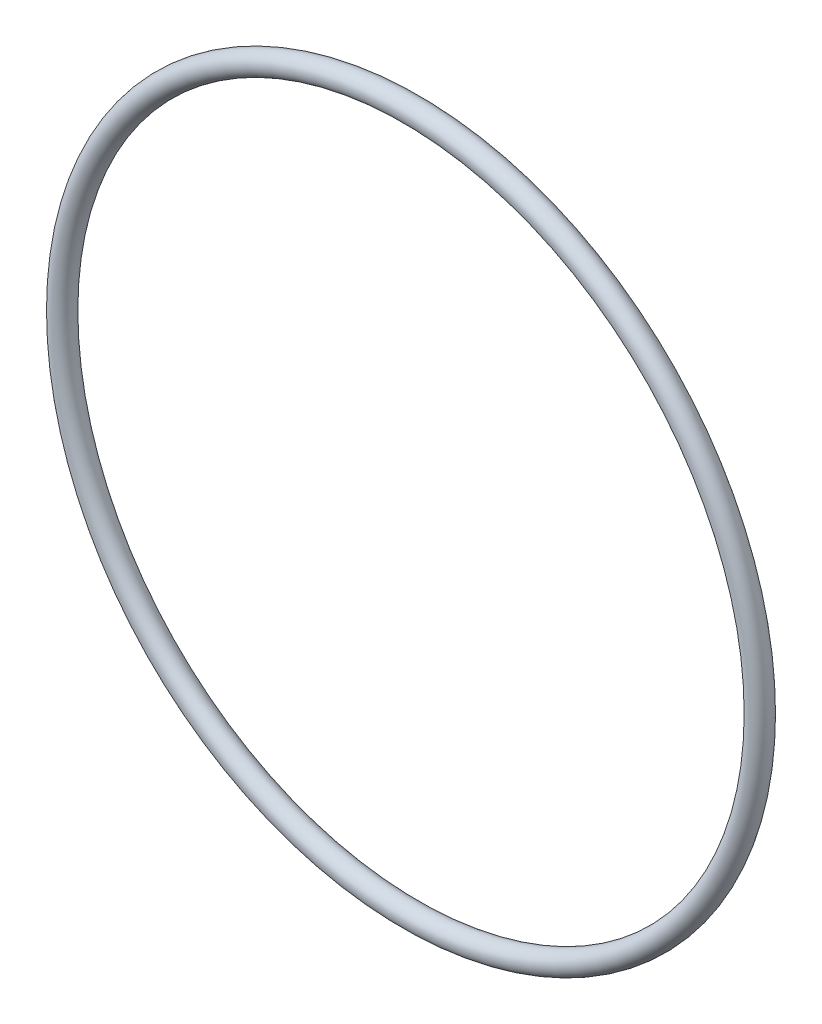
ISO-10303-21;
HEADER;
FILE_DESCRIPTION(('STEP AP214'),'2;1');
FILE_NAME('part.step','',(''),(''),'','','');
FILE_SCHEMA(('AUTOMOTIVE_DESIGN { 1 0 10303 214 1 1 1 1 }'));
ENDSEC;
DATA;
#1=APPLICATION_CONTEXT('core data for automotive mechanical design processes');
#2=APPLICATION_PROTOCOL_DEFINITION('international standard','automotive_design',2000,#1);
#3=PRODUCT_CONTEXT('',#1,'mechanical');
#4=PRODUCT('Part','Part','',(#3));
#5=PRODUCT_RELATED_PRODUCT_CATEGORY('part','',(#4));
#6=PRODUCT_DEFINITION_FORMATION('','',#4);
#7=PRODUCT_DEFINITION_CONTEXT('part definition',#1,'design');
#8=PRODUCT_DEFINITION('design','',#6,#7);
#9=PRODUCT_DEFINITION_SHAPE('','',#8);
#10=(LENGTH_UNIT() NAMED_UNIT(*) SI_UNIT(.MILLI.,.METRE.));
#11=(NAMED_UNIT(*) PLANE_ANGLE_UNIT() SI_UNIT($,.RADIAN.));
#12=(NAMED_UNIT(*) SI_UNIT($,.STERADIAN.) SOLID_ANGLE_UNIT());
#13=UNCERTAINTY_MEASURE_WITH_UNIT(LENGTH_MEASURE(1.E-05),#10,'distance_accuracy_value','');
#14=(GEOMETRIC_REPRESENTATION_CONTEXT(3) GLOBAL_UNCERTAINTY_ASSIGNED_CONTEXT((#13)) GLOBAL_UNIT_ASSIGNED_CONTEXT((#10,
#11,#12)) REPRESENTATION_CONTEXT('',''));
#15=CARTESIAN_POINT('',(0.,0.,0.));
#16=DIRECTION('',(0.,0.,1.));
#17=DIRECTION('',(1.,0.,0.));
#18=AXIS2_PLACEMENT_3D('',#15,#16,#17);
#19=CARTESIAN_POINT('',(0.,0.,0.));
#20=DIRECTION('',(0.,0.,1.));
#21=DIRECTION('',(1.,0.,0.));
#22=AXIS2_PLACEMENT_3D('',#19,#20,#21);
#23=TOROIDAL_SURFACE('',#22,55.5371,1.76530000000001);
#24=CARTESIAN_POINT('',(57.3024,0.,0.));
#25=VERTEX_POINT('',#24);
#26=VERTEX_LOOP('',#25);
#27=FACE_BOUND('',#26,.T.);
#28=ADVANCED_FACE('F31',(#27),#23,.T.);
#29=CLOSED_SHELL('',(#28));
#30=MANIFOLD_SOLID_BREP('B2',#29);
#31=ADVANCED_BREP_SHAPE_REPRESENTATION('',(#18,#30),#14);
#32=SHAPE_DEFINITION_REPRESENTATION(#9,#31);
ENDSEC;
END-ISO-10303-21;
